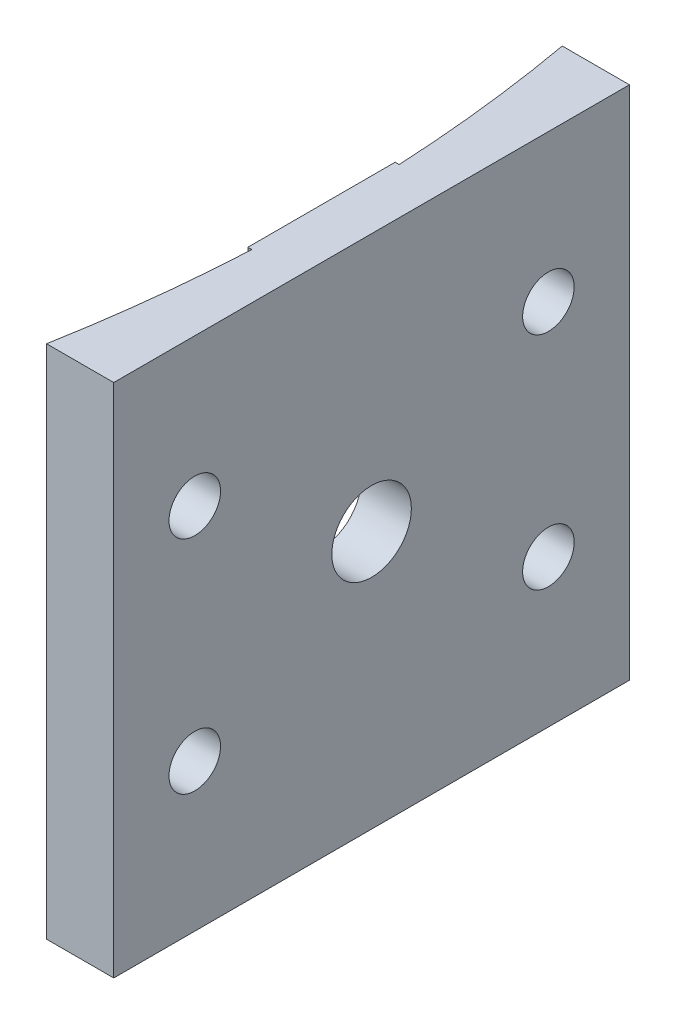
ISO-10303-21;
HEADER;
FILE_DESCRIPTION(('STEP AP214'),'2;1');
FILE_NAME('part.step','',(''),(''),'','','');
FILE_SCHEMA(('AUTOMOTIVE_DESIGN { 1 0 10303 214 1 1 1 1 }'));
ENDSEC;
DATA;
#1=APPLICATION_CONTEXT('core data for automotive mechanical design processes');
#2=APPLICATION_PROTOCOL_DEFINITION('international standard','automotive_design',2000,#1);
#3=PRODUCT_CONTEXT('',#1,'mechanical');
#4=PRODUCT('Part','Part','',(#3));
#5=PRODUCT_RELATED_PRODUCT_CATEGORY('part','',(#4));
#6=PRODUCT_DEFINITION_FORMATION('','',#4);
#7=PRODUCT_DEFINITION_CONTEXT('part definition',#1,'design');
#8=PRODUCT_DEFINITION('design','',#6,#7);
#9=PRODUCT_DEFINITION_SHAPE('','',#8);
#10=(LENGTH_UNIT() NAMED_UNIT(*) SI_UNIT(.MILLI.,.METRE.));
#11=(NAMED_UNIT(*) PLANE_ANGLE_UNIT() SI_UNIT($,.RADIAN.));
#12=(NAMED_UNIT(*) SI_UNIT($,.STERADIAN.) SOLID_ANGLE_UNIT());
#13=UNCERTAINTY_MEASURE_WITH_UNIT(LENGTH_MEASURE(1.E-05),#10,'distance_accuracy_value','');
#14=(GEOMETRIC_REPRESENTATION_CONTEXT(3) GLOBAL_UNCERTAINTY_ASSIGNED_CONTEXT((#13)) GLOBAL_UNIT_ASSIGNED_CONTEXT((#10,
#11,#12)) REPRESENTATION_CONTEXT('',''));
#15=CARTESIAN_POINT('',(0.,0.,0.));
#16=DIRECTION('',(0.,0.,1.));
#17=DIRECTION('',(1.,0.,0.));
#18=AXIS2_PLACEMENT_3D('',#15,#16,#17);
#19=CARTESIAN_POINT('',(-102.,35.,0.));
#20=DIRECTION('',(0.,-1.,0.));
#21=DIRECTION('',(0.,0.,-1.));
#22=AXIS2_PLACEMENT_3D('',#19,#20,#21);
#23=CYLINDRICAL_SURFACE('',#22,99.);
#24=CARTESIAN_POINT('',(-3.95951091513262,25.,-13.75));
#25=CARTESIAN_POINT('',(-3.95951015961151,25.0976164375348,-13.7499955551443));
#26=CARTESIAN_POINT('',(-3.95836029567689,25.1953039062939,-13.7418035521784));
#27=CARTESIAN_POINT('',(-3.95380343744229,25.3879742759688,-13.7092523154623));
#28=CARTESIAN_POINT('',(-3.95039372602132,25.482953777407,-13.6848736196253));
#29=CARTESIAN_POINT('',(-3.94145689598981,25.6673749024551,-13.6206889555918));
#30=CARTESIAN_POINT('',(-3.93593126068859,25.7568203546478,-13.58089379445));
#31=CARTESIAN_POINT('',(-3.92298215464231,25.9277140103037,-13.4870605684399));
#32=CARTESIAN_POINT('',(-3.91555911173377,26.0091640108967,-13.4330257143205));
#33=CARTESIAN_POINT('',(-3.89905871803999,26.1622165018625,-13.3119891987333));
#34=CARTESIAN_POINT('',(-3.88997375634697,26.2337709121461,-13.2449277897647));
#35=CARTESIAN_POINT('',(-3.8705068958684,26.3646295931061,-13.0999207798773));
#36=CARTESIAN_POINT('',(-3.8601248906135,26.4239328570712,-13.0219742853816));
#37=CARTESIAN_POINT('',(-3.83833050629281,26.5291575730448,-12.8566575715828));
#38=CARTESIAN_POINT('',(-3.82690978374474,26.5749553061033,-12.7692096979049));
#39=CARTESIAN_POINT('',(-3.80350183876466,26.6512126532621,-12.5879344720509));
#40=CARTESIAN_POINT('',(-3.7915145935306,26.6816716494152,-12.4941068630292));
#41=CARTESIAN_POINT('',(-3.76727034491341,26.726575195676,-12.3020425453514));
#42=CARTESIAN_POINT('',(-3.75501206155977,26.7409094536987,-12.2037801961855));
#43=CARTESIAN_POINT('',(-3.73067358567458,26.7527846743235,-12.0062229938682));
#44=CARTESIAN_POINT('',(-3.71859339561226,26.7503254043071,-11.9069281264337));
#45=CARTESIAN_POINT('',(-3.69492943079146,26.7286426367826,-11.7099512717694));
#46=CARTESIAN_POINT('',(-3.68334652702066,26.7093908913738,-11.6122722849954));
#47=CARTESIAN_POINT('',(-3.66100137251392,26.6545943827605,-11.4214963372181));
#48=CARTESIAN_POINT('',(-3.65023911235977,26.6190498065751,-11.3283993236335));
#49=CARTESIAN_POINT('',(-3.62982875764683,26.5327822782239,-11.1497745967534));
#50=CARTESIAN_POINT('',(-3.6201771040011,26.4821097950044,-11.0642229216504));
#51=CARTESIAN_POINT('',(-3.60216038060131,26.3669492368691,-10.9028327522666));
#52=CARTESIAN_POINT('',(-3.59379527188696,26.3024615804582,-10.8269939638634));
#53=CARTESIAN_POINT('',(-3.57856664239034,26.1619083203175,-10.6876727921158));
#54=CARTESIAN_POINT('',(-3.57169451610227,26.0859135996912,-10.6241198409789));
#55=CARTESIAN_POINT('',(-3.55951610529984,25.9242178963469,-10.5106801016616));
#56=CARTESIAN_POINT('',(-3.55420977035069,25.8385172263845,-10.4607928733065));
#57=CARTESIAN_POINT('',(-3.54527957567457,25.6603812139411,-10.3764071343207));
#58=CARTESIAN_POINT('',(-3.54164609232484,25.5679880243216,-10.3418206474029));
#59=CARTESIAN_POINT('',(-3.5360736652391,25.3786615215405,-10.2886312171122));
#60=CARTESIAN_POINT('',(-3.53413468042049,25.2817283185101,-10.2700278862327));
#61=CARTESIAN_POINT('',(-3.53198468924484,25.0864749470769,-10.2493936422242));
#62=CARTESIAN_POINT('',(-3.53176703701814,24.9881615825641,-10.2472989910657));
#63=CARTESIAN_POINT('',(-3.53304540319038,24.7925803985085,-10.25957548569));
#64=CARTESIAN_POINT('',(-3.5345414030281,24.6953125676526,-10.2739464531273));
#65=CARTESIAN_POINT('',(-3.53922224859818,24.5046876291043,-10.3187084916972));
#66=CARTESIAN_POINT('',(-3.54240531513644,24.4113265130667,-10.3490826854989));
#67=CARTESIAN_POINT('',(-3.55040995502397,24.2310428532586,-10.4249540378177));
#68=CARTESIAN_POINT('',(-3.55523153536824,24.1441203369772,-10.4704512608967));
#69=CARTESIAN_POINT('',(-3.56644492722229,23.978992430418,-10.5753492957071));
#70=CARTESIAN_POINT('',(-3.57283974099436,23.9008041277429,-10.6347766805506));
#71=CARTESIAN_POINT('',(-3.58708143691633,23.7555152350919,-10.7657693246648));
#72=CARTESIAN_POINT('',(-3.59492834823328,23.6884148678812,-10.8373348277411));
#73=CARTESIAN_POINT('',(-3.61196205303933,23.5668713000661,-10.9909040952871));
#74=CARTESIAN_POINT('',(-3.62115477252247,23.5124869948434,-11.0729538103884));
#75=CARTESIAN_POINT('',(-3.64065932471052,23.4182533671679,-11.2448912399506));
#76=CARTESIAN_POINT('',(-3.65097119153151,23.3784044879747,-11.3347791933359));
#77=CARTESIAN_POINT('',(-3.672543197541,23.3141153018821,-11.5204173264421));
#78=CARTESIAN_POINT('',(-3.68380870894254,23.2897699187098,-11.6161997555861));
#79=CARTESIAN_POINT('',(-3.70695090240162,23.2575156319509,-11.8104217207582));
#80=CARTESIAN_POINT('',(-3.71882760651413,23.2496073219248,-11.9088613526106));
#81=CARTESIAN_POINT('',(-3.74293712122458,23.2504249455072,-12.1061771930534));
#82=CARTESIAN_POINT('',(-3.75517152749343,23.2592423366252,-12.2050528354288));
#83=CARTESIAN_POINT('',(-3.77957480534396,23.2934366318264,-12.3999080769154));
#84=CARTESIAN_POINT('',(-3.79174367544479,23.3188139085304,-12.4958876108091));
#85=CARTESIAN_POINT('',(-3.81566014994089,23.3855003184903,-12.6824397336715));
#86=CARTESIAN_POINT('',(-3.82740678251605,23.4268439167754,-12.7730001330476));
#87=CARTESIAN_POINT('',(-3.85005615577485,23.5243189459354,-12.9458925658594));
#88=CARTESIAN_POINT('',(-3.86095893635335,23.5804496771645,-13.0282249883437));
#89=CARTESIAN_POINT('',(-3.8814992824427,23.7057361174205,-13.182026708021));
#90=CARTESIAN_POINT('',(-3.89114087815252,23.7748485276824,-13.2535307296586));
#91=CARTESIAN_POINT('',(-3.90884285860038,23.9243103666188,-13.3839169391409));
#92=CARTESIAN_POINT('',(-3.91690291148195,24.0046621476144,-13.4427964782195));
#93=CARTESIAN_POINT('',(-3.93107088993435,24.1736676841981,-13.545768103841));
#94=CARTESIAN_POINT('',(-3.93719275877778,24.2622559213807,-13.5899659293753));
#95=CARTESIAN_POINT('',(-3.94731352859605,24.4456416208402,-13.6627977086289));
#96=CARTESIAN_POINT('',(-3.95131512796568,24.5404310175721,-13.6914514458928));
#97=CARTESIAN_POINT('',(-3.9559470110677,24.696546311928,-13.724570079985));
#98=CARTESIAN_POINT('',(-3.95728119234232,24.7568251571681,-13.7340937314737));
#99=CARTESIAN_POINT('',(-3.95906337792135,24.8780600966014,-13.7468100623831));
#100=CARTESIAN_POINT('',(-3.95951138712852,24.939016187046,-13.75000277683));
#101=CARTESIAN_POINT('',(-3.95951091513262,25.,-13.75));
#102=B_SPLINE_CURVE_WITH_KNOTS('',3,(#24,#25,#26,#27,#28,#29,#30,#31,#32,#33,#34,#35,#36,#37,
#38,#39,#40,#41,#42,#43,#44,#45,#46,#47,#48,#49,#50,#51,#52,#53,#54,#55,#56,#57,#58,#59,#60,#61,
#62,#63,#64,#65,#66,#67,#68,#69,#70,#71,#72,#73,#74,#75,#76,#77,#78,#79,#80,#81,#82,#83,#84,#85,
#86,#87,#88,#89,#90,#91,#92,#93,#94,#95,#96,#97,#98,#99,#100,#101),.UNSPECIFIED.,.T.,.F.,(4,2,2,
2,2,2,2,2,2,2,2,2,2,2,2,2,2,2,2,2,2,2,2,2,2,2,2,2,2,2,2,2,2,2,2,2,2,2,4),(0.,0.292625517213043,
0.58560351169091,0.878376497017822,1.1710835246419,1.46516620801501,1.75927304738946,
2.05599587741712,2.35273066047285,2.65148297685258,2.95023943146214,3.24949941835558,
3.5487559702418,3.84702510704684,4.14528520962495,4.44177764053079,4.73826052025198,
5.03301579230245,5.32776391790036,5.62137349620185,5.91497989433361,6.20827726711834,
6.50157589203927,6.79543863183602,7.08930727484582,7.38451116244565,7.67972405156938,
7.97672749837146,8.27374167010297,8.57238462280469,8.8710342956243,9.17033227228723,
9.46961609035775,9.76791886172395,10.0662841594364,10.3624514990382,10.6582410056705,
10.8410536444921,11.023865271898),.UNSPECIFIED.);
#103=CARTESIAN_POINT('',(-3.95951091513262,25.,-13.75));
#104=VERTEX_POINT('',#103);
#105=EDGE_CURVE('E169',#104,#104,#102,.T.);
#106=ORIENTED_EDGE('',*,*,#105,.T.);
#107=EDGE_LOOP('',(#106));
#108=FACE_BOUND('',#107,.T.);
#109=CARTESIAN_POINT('',(-3.95951091513262,10.,-13.75));
#110=CARTESIAN_POINT('',(-3.95951015961151,10.0976164375348,-13.7499955551443));
#111=CARTESIAN_POINT('',(-3.95836029567689,10.1953039062939,-13.7418035521785));
#112=CARTESIAN_POINT('',(-3.95380343744229,10.3879742759688,-13.7092523154623));
#113=CARTESIAN_POINT('',(-3.95039372602132,10.4829537774069,-13.6848736196253));
#114=CARTESIAN_POINT('',(-3.94145689598981,10.6673749024551,-13.6206889555918));
#115=CARTESIAN_POINT('',(-3.93593126068859,10.7568203546478,-13.58089379445));
#116=CARTESIAN_POINT('',(-3.92298215464231,10.9277140103037,-13.4870605684399));
#117=CARTESIAN_POINT('',(-3.91555911173377,11.0091640108967,-13.4330257143205));
#118=CARTESIAN_POINT('',(-3.89905871803999,11.1622165018625,-13.3119891987333));
#119=CARTESIAN_POINT('',(-3.88997375634697,11.2337709121461,-13.2449277897647));
#120=CARTESIAN_POINT('',(-3.87050689586839,11.3646295931061,-13.0999207798773));
#121=CARTESIAN_POINT('',(-3.8601248906135,11.4239328570711,-13.0219742853816));
#122=CARTESIAN_POINT('',(-3.83833050629281,11.5291575730448,-12.8566575715828));
#123=CARTESIAN_POINT('',(-3.82690978374474,11.5749553061033,-12.7692096979049));
#124=CARTESIAN_POINT('',(-3.80350183876466,11.6512126532621,-12.587934472051));
#125=CARTESIAN_POINT('',(-3.7915145935306,11.6816716494152,-12.4941068630292));
#126=CARTESIAN_POINT('',(-3.76727034491341,11.726575195676,-12.3020425453514));
#127=CARTESIAN_POINT('',(-3.75501206155977,11.7409094536987,-12.2037801961855));
#128=CARTESIAN_POINT('',(-3.73067358567458,11.7527846743235,-12.0062229938682));
#129=CARTESIAN_POINT('',(-3.71859339561226,11.7503254043071,-11.9069281264337));
#130=CARTESIAN_POINT('',(-3.69492943079146,11.7286426367826,-11.7099512717694));
#131=CARTESIAN_POINT('',(-3.68334652702066,11.7093908913738,-11.6122722849954));
#132=CARTESIAN_POINT('',(-3.66100137251392,11.6545943827605,-11.4214963372181));
#133=CARTESIAN_POINT('',(-3.65023911235977,11.6190498065751,-11.3283993236336));
#134=CARTESIAN_POINT('',(-3.62982875764683,11.5327822782239,-11.1497745967534));
#135=CARTESIAN_POINT('',(-3.6201771040011,11.4821097950044,-11.0642229216504));
#136=CARTESIAN_POINT('',(-3.60216038060132,11.3669492368691,-10.9028327522667));
#137=CARTESIAN_POINT('',(-3.59379527188698,11.3024615804582,-10.8269939638634));
#138=CARTESIAN_POINT('',(-3.57856664239035,11.1619083203175,-10.6876727921158));
#139=CARTESIAN_POINT('',(-3.57169451610227,11.0859135996912,-10.6241198409789));
#140=CARTESIAN_POINT('',(-3.55951610529983,10.9242178963469,-10.5106801016616));
#141=CARTESIAN_POINT('',(-3.55420977035069,10.8385172263845,-10.4607928733065));
#142=CARTESIAN_POINT('',(-3.54527957567457,10.6603812139411,-10.3764071343207));
#143=CARTESIAN_POINT('',(-3.54164609232483,10.5679880243216,-10.3418206474029));
#144=CARTESIAN_POINT('',(-3.5360736652391,10.3786615215405,-10.2886312171122));
#145=CARTESIAN_POINT('',(-3.53413468042048,10.2817283185101,-10.2700278862327));
#146=CARTESIAN_POINT('',(-3.53198468924484,10.0864749470769,-10.2493936422242));
#147=CARTESIAN_POINT('',(-3.53176703701813,9.98816158256413,-10.2472989910657));
#148=CARTESIAN_POINT('',(-3.53304540319038,9.79258039850849,-10.25957548569));
#149=CARTESIAN_POINT('',(-3.53454140302811,9.69531256765256,-10.2739464531273));
#150=CARTESIAN_POINT('',(-3.53922224859817,9.50468762910431,-10.3187084916972));
#151=CARTESIAN_POINT('',(-3.54240531513642,9.41132651306668,-10.3490826854989));
#152=CARTESIAN_POINT('',(-3.55040995502395,9.23104285325859,-10.4249540378177));
#153=CARTESIAN_POINT('',(-3.55523153536824,9.14412033697719,-10.4704512608967));
#154=CARTESIAN_POINT('',(-3.56644492722231,8.97899243041798,-10.5753492957071));
#155=CARTESIAN_POINT('',(-3.57283974099438,8.90080412774286,-10.6347766805506));
#156=CARTESIAN_POINT('',(-3.58708143691633,8.75551523509185,-10.7657693246648));
#157=CARTESIAN_POINT('',(-3.59492834823328,8.6884148678812,-10.8373348277411));
#158=CARTESIAN_POINT('',(-3.61196205303933,8.56687130006606,-10.9909040952872));
#159=CARTESIAN_POINT('',(-3.62115477252247,8.51248699484337,-11.0729538103884));
#160=CARTESIAN_POINT('',(-3.64065932471052,8.41825336716793,-11.2448912399506));
#161=CARTESIAN_POINT('',(-3.65097119153151,8.37840448797466,-11.3347791933359));
#162=CARTESIAN_POINT('',(-3.672543197541,8.31411530188205,-11.5204173264421));
#163=CARTESIAN_POINT('',(-3.68380870894255,8.28976991870976,-11.6161997555862));
#164=CARTESIAN_POINT('',(-3.70695090240163,8.2575156319509,-11.8104217207582));
#165=CARTESIAN_POINT('',(-3.71882760651413,8.24960732192481,-11.9088613526106));
#166=CARTESIAN_POINT('',(-3.74293712122458,8.25042494550721,-12.1061771930534));
#167=CARTESIAN_POINT('',(-3.75517152749343,8.25924233662517,-12.2050528354288));
#168=CARTESIAN_POINT('',(-3.77957480534396,8.29343663182643,-12.3999080769154));
#169=CARTESIAN_POINT('',(-3.79174367544478,8.31881390853043,-12.4958876108091));
#170=CARTESIAN_POINT('',(-3.8156601499409,8.38550031849029,-12.6824397336715));
#171=CARTESIAN_POINT('',(-3.82740678251608,8.42684391677535,-12.7730001330476));
#172=CARTESIAN_POINT('',(-3.85005615577487,8.52431894593536,-12.9458925658595));
#173=CARTESIAN_POINT('',(-3.86095893635336,8.58044967716446,-13.0282249883437));
#174=CARTESIAN_POINT('',(-3.88149928244269,8.70573611742046,-13.182026708021));
#175=CARTESIAN_POINT('',(-3.89114087815252,8.77484852768238,-13.2535307296586));
#176=CARTESIAN_POINT('',(-3.90884285860038,8.92431036661879,-13.3839169391409));
#177=CARTESIAN_POINT('',(-3.91690291148195,9.00466214761443,-13.4427964782195));
#178=CARTESIAN_POINT('',(-3.93107088993435,9.17366768419808,-13.545768103841));
#179=CARTESIAN_POINT('',(-3.93719275877778,9.26225592138072,-13.5899659293753));
#180=CARTESIAN_POINT('',(-3.94731352859605,9.44564162084022,-13.6627977086289));
#181=CARTESIAN_POINT('',(-3.95131512796568,9.54043101757206,-13.6914514458928));
#182=CARTESIAN_POINT('',(-3.9559470110677,9.69654631192802,-13.7245700799851));
#183=CARTESIAN_POINT('',(-3.95728119234232,9.7568251571681,-13.7340937314737));
#184=CARTESIAN_POINT('',(-3.95906337792135,9.87806009660144,-13.7468100623832));
#185=CARTESIAN_POINT('',(-3.95951138712852,9.93901618704596,-13.75000277683));
#186=CARTESIAN_POINT('',(-3.95951091513262,10.,-13.75));
#187=B_SPLINE_CURVE_WITH_KNOTS('',3,(#109,#110,#111,#112,#113,#114,#115,#116,#117,#118,#119,
#120,#121,#122,#123,#124,#125,#126,#127,#128,#129,#130,#131,#132,#133,#134,#135,#136,#137,#138,
#139,#140,#141,#142,#143,#144,#145,#146,#147,#148,#149,#150,#151,#152,#153,#154,#155,#156,#157,
#158,#159,#160,#161,#162,#163,#164,#165,#166,#167,#168,#169,#170,#171,#172,#173,#174,#175,#176,
#177,#178,#179,#180,#181,#182,#183,#184,#185,#186),.UNSPECIFIED.,.T.,.F.,(4,2,2,2,2,2,2,2,2,2,2,
2,2,2,2,2,2,2,2,2,2,2,2,2,2,2,2,2,2,2,2,2,2,2,2,2,2,2,4),(0.,0.292625517213046,0.58560351169091,
0.878376497017824,1.1710835246419,1.46516620801501,1.75927304738946,2.05599587741712,
2.35273066047285,2.65148297685258,2.95023943146213,3.24949941835558,3.5487559702418,
3.84702510704685,4.14528520962495,4.44177764053079,4.73826052025198,5.03301579230244,
5.32776391790036,5.62137349620185,5.9149798943336,6.20827726711833,6.50157589203927,
6.79543863183602,7.08930727484582,7.38451116244565,7.67972405156938,7.97672749837146,
8.27374167010297,8.57238462280469,8.87103429562429,9.17033227228723,9.46961609035774,
9.76791886172394,10.0662841594364,10.3624514990381,10.6582410056704,10.8410536444921,
11.023865271898),.UNSPECIFIED.);
#188=CARTESIAN_POINT('',(-3.95951091513262,10.,-13.75));
#189=VERTEX_POINT('',#188);
#190=EDGE_CURVE('E213',#189,#189,#187,.T.);
#191=ORIENTED_EDGE('',*,*,#190,.T.);
#192=EDGE_LOOP('',(#191));
#193=FACE_BOUND('',#192,.T.);
#194=CARTESIAN_POINT('',(-102.,0.,0.));
#195=DIRECTION('',(0.,-1.,0.));
#196=DIRECTION('',(0.,0.,-1.));
#197=AXIS2_PLACEMENT_3D('',#194,#195,#196);
#198=CIRCLE('',#197,99.);
#199=CARTESIAN_POINT('',(-4.55899220554007,0.,-17.5));
#200=VERTEX_POINT('',#199);
#201=CARTESIAN_POINT('',(-3.12634324553381,0.,-5.));
#202=VERTEX_POINT('',#201);
#203=EDGE_CURVE('E216',#200,#202,#198,.T.);
#204=ORIENTED_EDGE('',*,*,#203,.T.);
#205=DIRECTION('',(0.,-1.,0.));
#206=VECTOR('',#205,1.);
#207=CARTESIAN_POINT('',(-3.12634324553381,35.,-5.));
#208=LINE('',#207,#206);
#209=CARTESIAN_POINT('',(-3.12634324553381,35.,-5.));
#210=VERTEX_POINT('',#209);
#211=EDGE_CURVE('E147',#202,#210,#208,.F.);
#212=ORIENTED_EDGE('',*,*,#211,.T.);
#213=CARTESIAN_POINT('',(-102.,35.,0.));
#214=DIRECTION('',(0.,-1.,0.));
#215=DIRECTION('',(0.,0.,-1.));
#216=AXIS2_PLACEMENT_3D('',#213,#214,#215);
#217=CIRCLE('',#216,99.);
#218=CARTESIAN_POINT('',(-4.55899220554007,35.,-17.5));
#219=VERTEX_POINT('',#218);
#220=EDGE_CURVE('E242',#219,#210,#217,.T.);
#221=ORIENTED_EDGE('',*,*,#220,.F.);
#222=DIRECTION('',(0.,-1.,0.));
#223=VECTOR('',#222,1.);
#224=CARTESIAN_POINT('',(-4.55899220554007,35.,-17.5));
#225=LINE('',#224,#223);
#226=EDGE_CURVE('E218',#219,#200,#225,.T.);
#227=ORIENTED_EDGE('',*,*,#226,.T.);
#228=EDGE_LOOP('',(#204,#212,#221,#227));
#229=FACE_BOUND('',#228,.T.);
#230=ADVANCED_FACE('F40',(#108,#193,#229),#23,.F.);
#231=CARTESIAN_POINT('',(-3.53204836090069,10.,10.25));
#232=CARTESIAN_POINT('',(-3.53204868662511,10.097887444823,10.2500043961752));
#233=CARTESIAN_POINT('',(-3.5329051649979,10.1958458819419,10.258241377475));
#234=CARTESIAN_POINT('',(-3.53632125542108,10.3890585550182,10.290978009585));
#235=CARTESIAN_POINT('',(-3.53888291333724,10.4843093991048,10.3154971956171));
#236=CARTESIAN_POINT('',(-3.54566996903115,10.6692734438731,10.3800744676662));
#237=CARTESIAN_POINT('',(-3.54989440952342,10.7589897965174,10.4201236126881));
#238=CARTESIAN_POINT('',(-3.55993809403711,10.9303819156705,10.514583054249));
#239=CARTESIAN_POINT('',(-3.56575695347512,11.0120596147016,10.568989887511));
#240=CARTESIAN_POINT('',(-3.57890453337222,11.1652933949565,10.6907302150733));
#241=CARTESIAN_POINT('',(-3.58623658457252,11.2368265504659,10.7580922027649));
#242=CARTESIAN_POINT('',(-3.60226582852257,11.3675757330012,10.9037271485257));
#243=CARTESIAN_POINT('',(-3.61096310497467,11.426791004296,10.9820007755578));
#244=CARTESIAN_POINT('',(-3.62959402856572,11.5315549681475,11.1476545076299));
#245=CARTESIAN_POINT('',(-3.63953383389495,11.57703143889,11.2350795910237));
#246=CARTESIAN_POINT('',(-3.6603923274957,11.6526716625235,11.4162107008546));
#247=CARTESIAN_POINT('',(-3.67131104722184,11.6828349231606,11.5099169290939));
#248=CARTESIAN_POINT('',(-3.69393306390296,11.7271849672355,11.7015624894893));
#249=CARTESIAN_POINT('',(-3.70564077869676,11.7412722121236,11.7995243378504));
#250=CARTESIAN_POINT('',(-3.72947094842239,11.7527715526598,11.996372330901));
#251=CARTESIAN_POINT('',(-3.74159341580014,11.7501831474665,12.095258503263));
#252=CARTESIAN_POINT('',(-3.76596668871585,11.7283662437093,12.2916450343408));
#253=CARTESIAN_POINT('',(-3.77821783016216,11.7090589931801,12.3891366115013));
#254=CARTESIAN_POINT('',(-3.80241563136248,11.6542366076279,12.5794926785744));
#255=CARTESIAN_POINT('',(-3.81436228680443,11.6187212432036,12.6723571029759));
#256=CARTESIAN_POINT('',(-3.83756710523225,11.5324335297884,12.8508709166891));
#257=CARTESIAN_POINT('',(-3.84882484983193,11.4816520179635,12.9365159332294));
#258=CARTESIAN_POINT('',(-3.87025189156947,11.3662417917952,13.0980603981883));
#259=CARTESIAN_POINT('',(-3.88042121044155,11.3016133540314,13.1739600412134));
#260=CARTESIAN_POINT('',(-3.89925096408295,11.1606592006505,13.3134510829646));
#261=CARTESIAN_POINT('',(-3.90791851352637,11.084392049958,13.3771006850457));
#262=CARTESIAN_POINT('',(-3.92347256922005,10.9220763479315,13.4906657922672));
#263=CARTESIAN_POINT('',(-3.93035916105714,10.8360282669224,13.5405819573977));
#264=CARTESIAN_POINT('',(-3.94202558930903,10.6573881475535,13.6248102994156));
#265=CARTESIAN_POINT('',(-3.94682311825756,10.564859089604,13.6592536000447));
#266=CARTESIAN_POINT('',(-3.95420284988752,10.3752495298495,13.7121253142508));
#267=CARTESIAN_POINT('',(-3.95678516418959,10.2781692576318,13.7305545347485));
#268=CARTESIAN_POINT('',(-3.95961665789014,10.0830305153615,13.750757762515));
#269=CARTESIAN_POINT('',(-3.95988399868674,9.98498571240509,13.7526614162284));
#270=CARTESIAN_POINT('',(-3.95812225472541,9.78997353477605,13.7400963279605));
#271=CARTESIAN_POINT('',(-3.95609322103836,9.69300613619063,13.7256279500898));
#272=CARTESIAN_POINT('',(-3.94982946191423,9.50314031116904,13.6808100017395));
#273=CARTESIAN_POINT('',(-3.94560010528369,9.4102325745942,13.6504990863522));
#274=CARTESIAN_POINT('',(-3.93510803040715,9.23084068749977,13.5749184247653));
#275=CARTESIAN_POINT('',(-3.9288452780728,9.1443566446984,13.5296484277877));
#276=CARTESIAN_POINT('',(-3.9144978321341,8.97983944591701,13.4252390284947));
#277=CARTESIAN_POINT('',(-3.90640518983835,8.90184542668019,13.3660390701023));
#278=CARTESIAN_POINT('',(-3.88871868970757,8.75688691201364,13.2355884470927));
#279=CARTESIAN_POINT('',(-3.87912476542891,8.68992290501883,13.1643372491014));
#280=CARTESIAN_POINT('',(-3.85869303186781,8.56831115379239,13.011144356223));
#281=CARTESIAN_POINT('',(-3.84784524927524,8.51377410067423,12.9291161203088));
#282=CARTESIAN_POINT('',(-3.82534921211498,8.41923544748236,12.7571725763272));
#283=CARTESIAN_POINT('',(-3.81370092176067,8.37923449774688,12.6672569156036));
#284=CARTESIAN_POINT('',(-3.78989065646064,8.31459263436157,12.4813167902549));
#285=CARTESIAN_POINT('',(-3.77772534841001,8.29007565687575,12.3852496497464));
#286=CARTESIAN_POINT('',(-3.75334758942826,8.25758151989589,12.1903622255084));
#287=CARTESIAN_POINT('',(-3.74113513724202,8.24960480383887,12.0915418680384));
#288=CARTESIAN_POINT('',(-3.71697811736929,8.25042674279611,11.8935942514708));
#289=CARTESIAN_POINT('',(-3.70503460254312,8.25928256834134,11.7944670921841));
#290=CARTESIAN_POINT('',(-3.68178541496707,8.29366077165245,11.5990674242888));
#291=CARTESIAN_POINT('',(-3.67047974050674,8.319183104723,11.5027949080256));
#292=CARTESIAN_POINT('',(-3.64881370210418,8.38614363124745,11.316049674678));
#293=CARTESIAN_POINT('',(-3.63845156728446,8.42755121551267,11.2255661915779));
#294=CARTESIAN_POINT('',(-3.61889045140774,8.52514687616519,11.0528208787297));
#295=CARTESIAN_POINT('',(-3.60969139461142,8.58133398937903,10.9705585136979));
#296=CARTESIAN_POINT('',(-3.59270037931174,8.70656761355651,10.8170846939411));
#297=CARTESIAN_POINT('',(-3.58490092698461,8.77554135693957,10.7458146908409));
#298=CARTESIAN_POINT('',(-3.57079727429844,8.92463191530595,10.615853066674));
#299=CARTESIAN_POINT('',(-3.56449339844012,9.00475114259462,10.5571641756433));
#300=CARTESIAN_POINT('',(-3.55352777940542,9.17334465668333,10.4544139434315));
#301=CARTESIAN_POINT('',(-3.54885698875484,9.26176935270849,10.4102720909057));
#302=CARTESIAN_POINT('',(-3.54118951439651,9.44477022031171,10.3375040289782));
#303=CARTESIAN_POINT('',(-3.53819076384134,9.53933863523857,10.3088586653189));
#304=CARTESIAN_POINT('',(-3.5347175849966,9.69543701990622,10.2756172800895));
#305=CARTESIAN_POINT('',(-3.53371739316317,9.75593673552128,10.26602316945));
#306=CARTESIAN_POINT('',(-3.53238268016409,9.87761505009889,10.2532131634536));
#307=CARTESIAN_POINT('',(-3.53204815723409,9.93879364726164,10.2499972511914));
#308=CARTESIAN_POINT('',(-3.53204836090069,10.,10.25));
#309=B_SPLINE_CURVE_WITH_KNOTS('',3,(#231,#232,#233,#234,#235,#236,#237,#238,#239,#240,#241,
#242,#243,#244,#245,#246,#247,#248,#249,#250,#251,#252,#253,#254,#255,#256,#257,#258,#259,#260,
#261,#262,#263,#264,#265,#266,#267,#268,#269,#270,#271,#272,#273,#274,#275,#276,#277,#278,#279,
#280,#281,#282,#283,#284,#285,#286,#287,#288,#289,#290,#291,#292,#293,#294,#295,#296,#297,#298,
#299,#300,#301,#302,#303,#304,#305,#306,#307,#308),.UNSPECIFIED.,.T.,.F.,(4,2,2,2,2,2,2,2,2,2,2,
2,2,2,2,2,2,2,2,2,2,2,2,2,2,2,2,2,2,2,2,2,2,2,2,2,2,2,4),(0.,0.293438394796063,
0.587229491595618,0.880851695864525,1.17440313895017,1.46860775524953,1.76283041637054,
2.05857385512196,2.35432680015272,2.65190120137114,2.94948454006824,3.24847727895147,
3.5474742497537,3.8466510398622,4.14582185474683,4.44353409639523,4.74123202833324,
5.03635721389823,5.33146752777099,5.62426052828199,5.91704701726609,6.20912243227925,
6.50120274396877,6.7945770371582,7.08796431816141,7.38387077781381,7.67979047454835,
7.97804970252283,8.27631692659072,8.57559900461218,8.87488028003867,9.1735877455602,
9.47227574930798,9.76931340741692,10.0664154560565,10.3618444267346,10.6569073966078,
10.8403869177584,11.0238659525962),.UNSPECIFIED.);
#310=CARTESIAN_POINT('',(-3.53204836090069,10.,10.25));
#311=VERTEX_POINT('',#310);
#312=EDGE_CURVE('E223',#311,#311,#309,.T.);
#313=ORIENTED_EDGE('',*,*,#312,.T.);
#314=EDGE_LOOP('',(#313));
#315=FACE_BOUND('',#314,.T.);
#316=CARTESIAN_POINT('',(-3.53204836090069,25.,10.25));
#317=CARTESIAN_POINT('',(-3.53204868662511,25.097887444823,10.2500043961752));
#318=CARTESIAN_POINT('',(-3.5329051649979,25.1958458819419,10.258241377475));
#319=CARTESIAN_POINT('',(-3.53632125542108,25.3890585550182,10.290978009585));
#320=CARTESIAN_POINT('',(-3.53888291333724,25.4843093991048,10.3154971956171));
#321=CARTESIAN_POINT('',(-3.54566996903115,25.6692734438731,10.3800744676662));
#322=CARTESIAN_POINT('',(-3.54989440952342,25.7589897965174,10.4201236126881));
#323=CARTESIAN_POINT('',(-3.55993809403711,25.9303819156705,10.514583054249));
#324=CARTESIAN_POINT('',(-3.56575695347512,26.0120596147016,10.568989887511));
#325=CARTESIAN_POINT('',(-3.57890453337222,26.1652933949565,10.6907302150733));
#326=CARTESIAN_POINT('',(-3.58623658457252,26.236826550466,10.7580922027649));
#327=CARTESIAN_POINT('',(-3.60226582852256,26.3675757330012,10.9037271485257));
#328=CARTESIAN_POINT('',(-3.61096310497467,26.426791004296,10.9820007755578));
#329=CARTESIAN_POINT('',(-3.62959402856572,26.5315549681475,11.1476545076299));
#330=CARTESIAN_POINT('',(-3.63953383389495,26.57703143889,11.2350795910237));
#331=CARTESIAN_POINT('',(-3.6603923274957,26.6526716625235,11.4162107008546));
#332=CARTESIAN_POINT('',(-3.67131104722184,26.6828349231606,11.5099169290939));
#333=CARTESIAN_POINT('',(-3.69393306390296,26.7271849672355,11.7015624894893));
#334=CARTESIAN_POINT('',(-3.70564077869676,26.7412722121236,11.7995243378504));
#335=CARTESIAN_POINT('',(-3.72947094842239,26.7527715526598,11.996372330901));
#336=CARTESIAN_POINT('',(-3.74159341580014,26.7501831474665,12.095258503263));
#337=CARTESIAN_POINT('',(-3.76596668871585,26.7283662437093,12.2916450343408));
#338=CARTESIAN_POINT('',(-3.77821783016216,26.7090589931801,12.3891366115013));
#339=CARTESIAN_POINT('',(-3.80241563136248,26.6542366076279,12.5794926785744));
#340=CARTESIAN_POINT('',(-3.81436228680442,26.6187212432036,12.6723571029759));
#341=CARTESIAN_POINT('',(-3.83756710523225,26.5324335297884,12.8508709166891));
#342=CARTESIAN_POINT('',(-3.84882484983193,26.4816520179635,12.9365159332294));
#343=CARTESIAN_POINT('',(-3.87025189156947,26.3662417917952,13.0980603981883));
#344=CARTESIAN_POINT('',(-3.88042121044155,26.3016133540314,13.1739600412134));
#345=CARTESIAN_POINT('',(-3.89925096408295,26.1606592006505,13.3134510829646));
#346=CARTESIAN_POINT('',(-3.90791851352637,26.084392049958,13.3771006850457));
#347=CARTESIAN_POINT('',(-3.92347256922005,25.9220763479315,13.4906657922672));
#348=CARTESIAN_POINT('',(-3.93035916105714,25.8360282669224,13.5405819573977));
#349=CARTESIAN_POINT('',(-3.94202558930903,25.6573881475535,13.6248102994156));
#350=CARTESIAN_POINT('',(-3.94682311825756,25.564859089604,13.6592536000447));
#351=CARTESIAN_POINT('',(-3.95420284988752,25.3752495298495,13.7121253142508));
#352=CARTESIAN_POINT('',(-3.95678516418958,25.2781692576318,13.7305545347485));
#353=CARTESIAN_POINT('',(-3.95961665789014,25.0830305153615,13.750757762515));
#354=CARTESIAN_POINT('',(-3.95988399868675,24.9849857124051,13.7526614162283));
#355=CARTESIAN_POINT('',(-3.95812225472542,24.7899735347761,13.7400963279605));
#356=CARTESIAN_POINT('',(-3.95609322103836,24.6930061361906,13.7256279500898));
#357=CARTESIAN_POINT('',(-3.94982946191422,24.503140311169,13.6808100017395));
#358=CARTESIAN_POINT('',(-3.94560010528369,24.4102325745942,13.6504990863522));
#359=CARTESIAN_POINT('',(-3.93510803040715,24.2308406874998,13.5749184247653));
#360=CARTESIAN_POINT('',(-3.9288452780728,24.1443566446984,13.5296484277877));
#361=CARTESIAN_POINT('',(-3.9144978321341,23.979839445917,13.4252390284947));
#362=CARTESIAN_POINT('',(-3.90640518983835,23.9018454266802,13.3660390701023));
#363=CARTESIAN_POINT('',(-3.88871868970757,23.7568869120136,13.2355884470927));
#364=CARTESIAN_POINT('',(-3.87912476542891,23.6899229050188,13.1643372491014));
#365=CARTESIAN_POINT('',(-3.8586930318678,23.5683111537924,13.011144356223));
#366=CARTESIAN_POINT('',(-3.84784524927524,23.5137741006742,12.9291161203088));
#367=CARTESIAN_POINT('',(-3.82534921211497,23.4192354474824,12.7571725763272));
#368=CARTESIAN_POINT('',(-3.81370092176067,23.3792344977469,12.6672569156036));
#369=CARTESIAN_POINT('',(-3.78989065646063,23.3145926343616,12.4813167902549));
#370=CARTESIAN_POINT('',(-3.77772534841001,23.2900756568758,12.3852496497464));
#371=CARTESIAN_POINT('',(-3.75334758942826,23.2575815198959,12.1903622255084));
#372=CARTESIAN_POINT('',(-3.74113513724202,23.2496048038389,12.0915418680384));
#373=CARTESIAN_POINT('',(-3.71697811736929,23.2504267427961,11.8935942514708));
#374=CARTESIAN_POINT('',(-3.70503460254312,23.2592825683413,11.7944670921841));
#375=CARTESIAN_POINT('',(-3.68178541496707,23.2936607716524,11.5990674242888));
#376=CARTESIAN_POINT('',(-3.67047974050674,23.319183104723,11.5027949080256));
#377=CARTESIAN_POINT('',(-3.64881370210418,23.3861436312474,11.316049674678));
#378=CARTESIAN_POINT('',(-3.63845156728446,23.4275512155127,11.2255661915779));
#379=CARTESIAN_POINT('',(-3.61889045140774,23.5251468761652,11.0528208787297));
#380=CARTESIAN_POINT('',(-3.60969139461142,23.581333989379,10.9705585136979));
#381=CARTESIAN_POINT('',(-3.59270037931174,23.7065676135565,10.8170846939411));
#382=CARTESIAN_POINT('',(-3.58490092698461,23.7755413569396,10.7458146908409));
#383=CARTESIAN_POINT('',(-3.57079727429843,23.9246319153059,10.615853066674));
#384=CARTESIAN_POINT('',(-3.56449339844012,24.0047511425946,10.5571641756433));
#385=CARTESIAN_POINT('',(-3.55352777940542,24.1733446566833,10.4544139434315));
#386=CARTESIAN_POINT('',(-3.54885698875484,24.2617693527085,10.4102720909057));
#387=CARTESIAN_POINT('',(-3.54118951439651,24.4447702203117,10.3375040289782));
#388=CARTESIAN_POINT('',(-3.53819076384134,24.5393386352386,10.3088586653189));
#389=CARTESIAN_POINT('',(-3.5347175849966,24.6954370199062,10.2756172800895));
#390=CARTESIAN_POINT('',(-3.53371739316317,24.7559367355213,10.26602316945));
#391=CARTESIAN_POINT('',(-3.53238268016409,24.8776150500989,10.2532131634536));
#392=CARTESIAN_POINT('',(-3.53204815723409,24.9387936472616,10.2499972511914));
#393=CARTESIAN_POINT('',(-3.53204836090069,25.,10.25));
#394=B_SPLINE_CURVE_WITH_KNOTS('',3,(#316,#317,#318,#319,#320,#321,#322,#323,#324,#325,#326,
#327,#328,#329,#330,#331,#332,#333,#334,#335,#336,#337,#338,#339,#340,#341,#342,#343,#344,#345,
#346,#347,#348,#349,#350,#351,#352,#353,#354,#355,#356,#357,#358,#359,#360,#361,#362,#363,#364,
#365,#366,#367,#368,#369,#370,#371,#372,#373,#374,#375,#376,#377,#378,#379,#380,#381,#382,#383,
#384,#385,#386,#387,#388,#389,#390,#391,#392,#393),.UNSPECIFIED.,.T.,.F.,(4,2,2,2,2,2,2,2,2,2,2,
2,2,2,2,2,2,2,2,2,2,2,2,2,2,2,2,2,2,2,2,2,2,2,2,2,2,2,4),(0.,0.293438394796063,
0.587229491595618,0.880851695864524,1.17440313895016,1.46860775524953,1.76283041637054,
2.05857385512196,2.35432680015272,2.65190120137115,2.94948454006824,3.24847727895147,
3.5474742497537,3.8466510398622,4.14582185474683,4.44353409639523,4.74123202833324,
5.03635721389824,5.331467527771,5.62426052828199,5.9170470172661,6.20912243227926,
6.50120274396877,6.79457703715821,7.08796431816141,7.38387077781381,7.67979047454835,
7.97804970252283,8.27631692659072,8.57559900461218,8.87488028003867,9.17358774556021,
9.47227574930799,9.76931340741693,10.0664154560565,10.3618444267346,10.6569073966078,
10.8403869177584,11.0238659525962),.UNSPECIFIED.);
#395=CARTESIAN_POINT('',(-3.53204836090069,25.,10.25));
#396=VERTEX_POINT('',#395);
#397=EDGE_CURVE('E162',#396,#396,#394,.T.);
#398=ORIENTED_EDGE('',*,*,#397,.T.);
#399=EDGE_LOOP('',(#398));
#400=FACE_BOUND('',#399,.T.);
#401=CARTESIAN_POINT('',(-3.12634324553381,35.,5.));
#402=VERTEX_POINT('',#401);
#403=CARTESIAN_POINT('',(-4.55899220554007,35.,17.5));
#404=VERTEX_POINT('',#403);
#405=EDGE_CURVE('E91',#402,#404,#217,.T.);
#406=ORIENTED_EDGE('',*,*,#405,.F.);
#407=DIRECTION('',(0.,-1.,0.));
#408=VECTOR('',#407,1.);
#409=CARTESIAN_POINT('',(-3.12634324553381,35.,5.));
#410=LINE('',#409,#408);
#411=CARTESIAN_POINT('',(-3.12634324553381,0.,5.));
#412=VERTEX_POINT('',#411);
#413=EDGE_CURVE('E144',#402,#412,#410,.T.);
#414=ORIENTED_EDGE('',*,*,#413,.T.);
#415=CARTESIAN_POINT('',(-4.55899220554007,0.,17.5));
#416=VERTEX_POINT('',#415);
#417=EDGE_CURVE('E123',#412,#416,#198,.T.);
#418=ORIENTED_EDGE('',*,*,#417,.T.);
#419=DIRECTION('',(0.,-1.,0.));
#420=VECTOR('',#419,1.);
#421=CARTESIAN_POINT('',(-4.55899220554007,35.,17.5));
#422=LINE('',#421,#420);
#423=EDGE_CURVE('E11',#404,#416,#422,.T.);
#424=ORIENTED_EDGE('',*,*,#423,.F.);
#425=EDGE_LOOP('',(#406,#414,#418,#424));
#426=FACE_BOUND('',#425,.T.);
#427=ADVANCED_FACE('F42',(#315,#400,#426),#23,.F.);
#428=CARTESIAN_POINT('',(0.,35.,17.5));
#429=DIRECTION('',(0.,0.,-1.));
#430=DIRECTION('',(-1.,0.,0.));
#431=AXIS2_PLACEMENT_3D('',#428,#429,#430);
#432=PLANE('',#431);
#433=DIRECTION('',(1.,0.,0.));
#434=VECTOR('',#433,1.);
#435=CARTESIAN_POINT('',(0.,0.,17.5));
#436=LINE('',#435,#434);
#437=CARTESIAN_POINT('',(0.,0.,17.5));
#438=VERTEX_POINT('',#437);
#439=EDGE_CURVE('E219',#416,#438,#436,.T.);
#440=ORIENTED_EDGE('',*,*,#439,.T.);
#441=DIRECTION('',(0.,-1.,0.));
#442=VECTOR('',#441,1.);
#443=CARTESIAN_POINT('',(0.,35.,17.5));
#444=LINE('',#443,#442);
#445=CARTESIAN_POINT('',(0.,35.,17.5));
#446=VERTEX_POINT('',#445);
#447=EDGE_CURVE('E50',#446,#438,#444,.T.);
#448=ORIENTED_EDGE('',*,*,#447,.F.);
#449=DIRECTION('',(1.,0.,0.));
#450=VECTOR('',#449,1.);
#451=CARTESIAN_POINT('',(0.,35.,17.5));
#452=LINE('',#451,#450);
#453=EDGE_CURVE('E240',#404,#446,#452,.T.);
#454=ORIENTED_EDGE('',*,*,#453,.F.);
#455=ORIENTED_EDGE('',*,*,#423,.T.);
#456=EDGE_LOOP('',(#440,#448,#454,#455));
#457=FACE_BOUND('',#456,.T.);
#458=ADVANCED_FACE('F195',(#457),#432,.F.);
#459=CARTESIAN_POINT('',(0.,35.,-17.5));
#460=DIRECTION('',(-1.,0.,0.));
#461=DIRECTION('',(0.,0.,1.));
#462=AXIS2_PLACEMENT_3D('',#459,#460,#461);
#463=PLANE('',#462);
#464=CARTESIAN_POINT('',(0.,17.5,0.));
#465=DIRECTION('',(1.,0.,0.));
#466=DIRECTION('',(0.,0.,-1.));
#467=AXIS2_PLACEMENT_3D('',#464,#465,#466);
#468=CIRCLE('',#467,2.7);
#469=CARTESIAN_POINT('',(0.,17.5,-2.69999999999998));
#470=VERTEX_POINT('',#469);
#471=EDGE_CURVE('E362',#470,#470,#468,.T.);
#472=ORIENTED_EDGE('',*,*,#471,.F.);
#473=EDGE_LOOP('',(#472));
#474=FACE_BOUND('',#473,.T.);
#475=CARTESIAN_POINT('',(0.,10.,12.));
#476=DIRECTION('',(1.,0.,0.));
#477=DIRECTION('',(0.,0.,-1.));
#478=AXIS2_PLACEMENT_3D('',#475,#476,#477);
#479=CIRCLE('',#478,1.75);
#480=CARTESIAN_POINT('',(0.,10.,10.25));
#481=VERTEX_POINT('',#480);
#482=EDGE_CURVE('E150',#481,#481,#479,.T.);
#483=ORIENTED_EDGE('',*,*,#482,.F.);
#484=EDGE_LOOP('',(#483));
#485=FACE_BOUND('',#484,.T.);
#486=CARTESIAN_POINT('',(0.,10.,-12.));
#487=DIRECTION('',(1.,0.,0.));
#488=DIRECTION('',(0.,0.,-1.));
#489=AXIS2_PLACEMENT_3D('',#486,#487,#488);
#490=CIRCLE('',#489,1.75);
#491=CARTESIAN_POINT('',(0.,10.,-13.75));
#492=VERTEX_POINT('',#491);
#493=EDGE_CURVE('E155',#492,#492,#490,.T.);
#494=ORIENTED_EDGE('',*,*,#493,.F.);
#495=EDGE_LOOP('',(#494));
#496=FACE_BOUND('',#495,.T.);
#497=CARTESIAN_POINT('',(0.,25.,-12.));
#498=DIRECTION('',(1.,0.,0.));
#499=DIRECTION('',(0.,0.,-1.));
#500=AXIS2_PLACEMENT_3D('',#497,#498,#499);
#501=CIRCLE('',#500,1.75);
#502=CARTESIAN_POINT('',(0.,25.,-13.75));
#503=VERTEX_POINT('',#502);
#504=EDGE_CURVE('E151',#503,#503,#501,.T.);
#505=ORIENTED_EDGE('',*,*,#504,.F.);
#506=EDGE_LOOP('',(#505));
#507=FACE_BOUND('',#506,.T.);
#508=CARTESIAN_POINT('',(0.,25.,12.));
#509=DIRECTION('',(1.,0.,0.));
#510=DIRECTION('',(0.,0.,-1.));
#511=AXIS2_PLACEMENT_3D('',#508,#509,#510);
#512=CIRCLE('',#511,1.75);
#513=CARTESIAN_POINT('',(0.,25.,10.25));
#514=VERTEX_POINT('',#513);
#515=EDGE_CURVE('E154',#514,#514,#512,.T.);
#516=ORIENTED_EDGE('',*,*,#515,.F.);
#517=EDGE_LOOP('',(#516));
#518=FACE_BOUND('',#517,.T.);
#519=DIRECTION('',(0.,0.,-1.));
#520=VECTOR('',#519,1.);
#521=CARTESIAN_POINT('',(0.,0.,-17.5));
#522=LINE('',#521,#520);
#523=CARTESIAN_POINT('',(0.,0.,-17.5));
#524=VERTEX_POINT('',#523);
#525=EDGE_CURVE('E221',#438,#524,#522,.T.);
#526=ORIENTED_EDGE('',*,*,#525,.T.);
#527=DIRECTION('',(0.,-1.,0.));
#528=VECTOR('',#527,1.);
#529=CARTESIAN_POINT('',(0.,35.,-17.5));
#530=LINE('',#529,#528);
#531=CARTESIAN_POINT('',(0.,35.,-17.5));
#532=VERTEX_POINT('',#531);
#533=EDGE_CURVE('E230',#532,#524,#530,.T.);
#534=ORIENTED_EDGE('',*,*,#533,.F.);
#535=DIRECTION('',(0.,0.,-1.));
#536=VECTOR('',#535,1.);
#537=CARTESIAN_POINT('',(0.,35.,-17.5));
#538=LINE('',#537,#536);
#539=EDGE_CURVE('E238',#446,#532,#538,.T.);
#540=ORIENTED_EDGE('',*,*,#539,.F.);
#541=ORIENTED_EDGE('',*,*,#447,.T.);
#542=EDGE_LOOP('',(#526,#534,#540,#541));
#543=FACE_BOUND('',#542,.T.);
#544=ADVANCED_FACE('F193',(#474,#485,#496,#507,#518,#543),#463,.F.);
#545=CARTESIAN_POINT('',(-4.55899220554007,35.,-17.5));
#546=DIRECTION('',(0.,0.,1.));
#547=DIRECTION('',(1.,0.,0.));
#548=AXIS2_PLACEMENT_3D('',#545,#546,#547);
#549=PLANE('',#548);
#550=DIRECTION('',(-1.,0.,0.));
#551=VECTOR('',#550,1.);
#552=CARTESIAN_POINT('',(-4.55899220554007,0.,-17.5));
#553=LINE('',#552,#551);
#554=EDGE_CURVE('E86',#524,#200,#553,.T.);
#555=ORIENTED_EDGE('',*,*,#554,.T.);
#556=ORIENTED_EDGE('',*,*,#226,.F.);
#557=DIRECTION('',(-1.,0.,0.));
#558=VECTOR('',#557,1.);
#559=CARTESIAN_POINT('',(-4.55899220554007,35.,-17.5));
#560=LINE('',#559,#558);
#561=EDGE_CURVE('E65',#532,#219,#560,.T.);
#562=ORIENTED_EDGE('',*,*,#561,.F.);
#563=ORIENTED_EDGE('',*,*,#533,.T.);
#564=EDGE_LOOP('',(#555,#556,#562,#563));
#565=FACE_BOUND('',#564,.T.);
#566=ADVANCED_FACE('F188',(#565),#549,.F.);
#567=CARTESIAN_POINT('',(-102.,35.,0.));
#568=DIRECTION('',(0.,-1.,0.));
#569=DIRECTION('',(0.,0.,-1.));
#570=AXIS2_PLACEMENT_3D('',#567,#568,#569);
#571=PLANE('',#570);
#572=ORIENTED_EDGE('',*,*,#220,.T.);
#573=DIRECTION('',(-1.,0.,0.));
#574=VECTOR('',#573,1.);
#575=CARTESIAN_POINT('',(-3.4,35.,-5.));
#576=LINE('',#575,#574);
#577=CARTESIAN_POINT('',(-3.4,35.,-5.));
#578=VERTEX_POINT('',#577);
#579=EDGE_CURVE('E145',#210,#578,#576,.T.);
#580=ORIENTED_EDGE('',*,*,#579,.T.);
#581=DIRECTION('',(0.,0.,1.));
#582=VECTOR('',#581,1.);
#583=CARTESIAN_POINT('',(-3.4,35.,5.));
#584=LINE('',#583,#582);
#585=CARTESIAN_POINT('',(-3.4,35.,5.));
#586=VERTEX_POINT('',#585);
#587=EDGE_CURVE('E141',#578,#586,#584,.T.);
#588=ORIENTED_EDGE('',*,*,#587,.T.);
#589=DIRECTION('',(1.,0.,0.));
#590=VECTOR('',#589,1.);
#591=CARTESIAN_POINT('',(-3.4,35.,5.));
#592=LINE('',#591,#590);
#593=EDGE_CURVE('E57',#586,#402,#592,.T.);
#594=ORIENTED_EDGE('',*,*,#593,.T.);
#595=ORIENTED_EDGE('',*,*,#405,.T.);
#596=ORIENTED_EDGE('',*,*,#453,.T.);
#597=ORIENTED_EDGE('',*,*,#539,.T.);
#598=ORIENTED_EDGE('',*,*,#561,.T.);
#599=EDGE_LOOP('',(#572,#580,#588,#594,#595,#596,#597,#598));
#600=FACE_BOUND('',#599,.T.);
#601=ADVANCED_FACE('F185',(#600),#571,.F.);
#602=CARTESIAN_POINT('',(-102.,0.,0.));
#603=DIRECTION('',(0.,-1.,0.));
#604=DIRECTION('',(0.,0.,-1.));
#605=AXIS2_PLACEMENT_3D('',#602,#603,#604);
#606=PLANE('',#605);
#607=ORIENTED_EDGE('',*,*,#417,.F.);
#608=DIRECTION('',(-1.,0.,0.));
#609=VECTOR('',#608,1.);
#610=CARTESIAN_POINT('',(-3.4,0.,5.));
#611=LINE('',#610,#609);
#612=CARTESIAN_POINT('',(-3.4,0.,5.));
#613=VERTEX_POINT('',#612);
#614=EDGE_CURVE('E115',#412,#613,#611,.T.);
#615=ORIENTED_EDGE('',*,*,#614,.T.);
#616=DIRECTION('',(0.,0.,-1.));
#617=VECTOR('',#616,1.);
#618=CARTESIAN_POINT('',(-3.4,0.,5.));
#619=LINE('',#618,#617);
#620=CARTESIAN_POINT('',(-3.4,0.,-5.));
#621=VERTEX_POINT('',#620);
#622=EDGE_CURVE('E120',#613,#621,#619,.T.);
#623=ORIENTED_EDGE('',*,*,#622,.T.);
#624=DIRECTION('',(1.,0.,0.));
#625=VECTOR('',#624,1.);
#626=CARTESIAN_POINT('',(-3.4,0.,-5.));
#627=LINE('',#626,#625);
#628=EDGE_CURVE('E133',#621,#202,#627,.T.);
#629=ORIENTED_EDGE('',*,*,#628,.T.);
#630=ORIENTED_EDGE('',*,*,#203,.F.);
#631=ORIENTED_EDGE('',*,*,#554,.F.);
#632=ORIENTED_EDGE('',*,*,#525,.F.);
#633=ORIENTED_EDGE('',*,*,#439,.F.);
#634=EDGE_LOOP('',(#607,#615,#623,#629,#630,#631,#632,#633));
#635=FACE_BOUND('',#634,.T.);
#636=ADVANCED_FACE('F117',(#635),#606,.T.);
#637=CARTESIAN_POINT('',(-4.55899220554007,25.,12.));
#638=DIRECTION('',(1.,0.,0.));
#639=DIRECTION('',(0.,0.,-1.));
#640=AXIS2_PLACEMENT_3D('',#637,#638,#639);
#641=CYLINDRICAL_SURFACE('',#640,1.75);
#642=ORIENTED_EDGE('',*,*,#515,.T.);
#643=EDGE_LOOP('',(#642));
#644=FACE_BOUND('',#643,.T.);
#645=ORIENTED_EDGE('',*,*,#397,.F.);
#646=EDGE_LOOP('',(#645));
#647=FACE_BOUND('',#646,.T.);
#648=ADVANCED_FACE('F175',(#644,#647),#641,.F.);
#649=CARTESIAN_POINT('',(-4.55899220554007,25.,-12.));
#650=DIRECTION('',(1.,0.,0.));
#651=DIRECTION('',(0.,0.,-1.));
#652=AXIS2_PLACEMENT_3D('',#649,#650,#651);
#653=CYLINDRICAL_SURFACE('',#652,1.75);
#654=ORIENTED_EDGE('',*,*,#504,.T.);
#655=EDGE_LOOP('',(#654));
#656=FACE_BOUND('',#655,.T.);
#657=ORIENTED_EDGE('',*,*,#105,.F.);
#658=EDGE_LOOP('',(#657));
#659=FACE_BOUND('',#658,.T.);
#660=ADVANCED_FACE('F180',(#656,#659),#653,.F.);
#661=CARTESIAN_POINT('',(-4.55899220554007,10.,-12.));
#662=DIRECTION('',(1.,0.,0.));
#663=DIRECTION('',(0.,0.,-1.));
#664=AXIS2_PLACEMENT_3D('',#661,#662,#663);
#665=CYLINDRICAL_SURFACE('',#664,1.75);
#666=ORIENTED_EDGE('',*,*,#493,.T.);
#667=EDGE_LOOP('',(#666));
#668=FACE_BOUND('',#667,.T.);
#669=ORIENTED_EDGE('',*,*,#190,.F.);
#670=EDGE_LOOP('',(#669));
#671=FACE_BOUND('',#670,.T.);
#672=ADVANCED_FACE('F259',(#668,#671),#665,.F.);
#673=CARTESIAN_POINT('',(-4.55899220554007,10.,12.));
#674=DIRECTION('',(1.,0.,0.));
#675=DIRECTION('',(0.,0.,-1.));
#676=AXIS2_PLACEMENT_3D('',#673,#674,#675);
#677=CYLINDRICAL_SURFACE('',#676,1.75);
#678=ORIENTED_EDGE('',*,*,#482,.T.);
#679=EDGE_LOOP('',(#678));
#680=FACE_BOUND('',#679,.T.);
#681=ORIENTED_EDGE('',*,*,#312,.F.);
#682=EDGE_LOOP('',(#681));
#683=FACE_BOUND('',#682,.T.);
#684=ADVANCED_FACE('F182',(#680,#683),#677,.F.);
#685=CARTESIAN_POINT('',(-3.4,45.0319489631876,-5.));
#686=DIRECTION('',(0.,0.,-1.));
#687=DIRECTION('',(-1.,0.,0.));
#688=AXIS2_PLACEMENT_3D('',#685,#686,#687);
#689=PLANE('',#688);
#690=ORIENTED_EDGE('',*,*,#211,.F.);
#691=ORIENTED_EDGE('',*,*,#628,.F.);
#692=DIRECTION('',(0.,-1.,0.));
#693=VECTOR('',#692,1.);
#694=CARTESIAN_POINT('',(-3.4,45.0319489631876,-5.));
#695=LINE('',#694,#693);
#696=EDGE_CURVE('E132',#578,#621,#695,.T.);
#697=ORIENTED_EDGE('',*,*,#696,.F.);
#698=ORIENTED_EDGE('',*,*,#579,.F.);
#699=EDGE_LOOP('',(#690,#691,#697,#698));
#700=FACE_BOUND('',#699,.T.);
#701=ADVANCED_FACE('F251',(#700),#689,.T.);
#702=CARTESIAN_POINT('',(-3.4,45.0319489631876,5.));
#703=DIRECTION('',(0.,0.,1.));
#704=DIRECTION('',(1.,0.,0.));
#705=AXIS2_PLACEMENT_3D('',#702,#703,#704);
#706=PLANE('',#705);
#707=ORIENTED_EDGE('',*,*,#413,.F.);
#708=ORIENTED_EDGE('',*,*,#593,.F.);
#709=DIRECTION('',(0.,-1.,0.));
#710=VECTOR('',#709,1.);
#711=CARTESIAN_POINT('',(-3.4,45.0319489631876,5.));
#712=LINE('',#711,#710);
#713=EDGE_CURVE('E128',#586,#613,#712,.T.);
#714=ORIENTED_EDGE('',*,*,#713,.T.);
#715=ORIENTED_EDGE('',*,*,#614,.F.);
#716=EDGE_LOOP('',(#707,#708,#714,#715));
#717=FACE_BOUND('',#716,.T.);
#718=ADVANCED_FACE('F129',(#717),#706,.T.);
#719=CARTESIAN_POINT('',(-3.4,45.0319489631876,5.));
#720=DIRECTION('',(-1.,0.,0.));
#721=DIRECTION('',(0.,0.,1.));
#722=AXIS2_PLACEMENT_3D('',#719,#720,#721);
#723=PLANE('',#722);
#724=CARTESIAN_POINT('',(-3.4,17.5,0.));
#725=DIRECTION('',(-1.,0.,0.));
#726=DIRECTION('',(0.,0.,1.));
#727=AXIS2_PLACEMENT_3D('',#724,#725,#726);
#728=CIRCLE('',#727,2.7);
#729=CARTESIAN_POINT('',(-3.4,17.5,2.70000000000002));
#730=VERTEX_POINT('',#729);
#731=EDGE_CURVE('E45',#730,#730,#728,.T.);
#732=ORIENTED_EDGE('',*,*,#731,.F.);
#733=EDGE_LOOP('',(#732));
#734=FACE_BOUND('',#733,.T.);
#735=ORIENTED_EDGE('',*,*,#587,.F.);
#736=ORIENTED_EDGE('',*,*,#696,.T.);
#737=ORIENTED_EDGE('',*,*,#622,.F.);
#738=ORIENTED_EDGE('',*,*,#713,.F.);
#739=EDGE_LOOP('',(#735,#736,#737,#738));
#740=FACE_BOUND('',#739,.T.);
#741=ADVANCED_FACE('F135',(#734,#740),#723,.T.);
#742=CARTESIAN_POINT('',(-4.55899220554007,17.5,0.));
#743=DIRECTION('',(1.,0.,0.));
#744=DIRECTION('',(0.,0.,-1.));
#745=AXIS2_PLACEMENT_3D('',#742,#743,#744);
#746=CYLINDRICAL_SURFACE('',#745,2.7);
#747=ORIENTED_EDGE('',*,*,#731,.T.);
#748=EDGE_LOOP('',(#747));
#749=FACE_BOUND('',#748,.T.);
#750=ORIENTED_EDGE('',*,*,#471,.T.);
#751=EDGE_LOOP('',(#750));
#752=FACE_BOUND('',#751,.T.);
#753=ADVANCED_FACE('F263',(#749,#752),#746,.F.);
#754=CLOSED_SHELL('',(#230,#427,#458,#544,#566,#601,#636,#648,#660,#672,#684,#701,#718,#741,#753));
#755=MANIFOLD_SOLID_BREP('B2',#754);
#756=ADVANCED_BREP_SHAPE_REPRESENTATION('',(#18,#755),#14);
#757=SHAPE_DEFINITION_REPRESENTATION(#9,#756);
ENDSEC;
END-ISO-10303-21;
